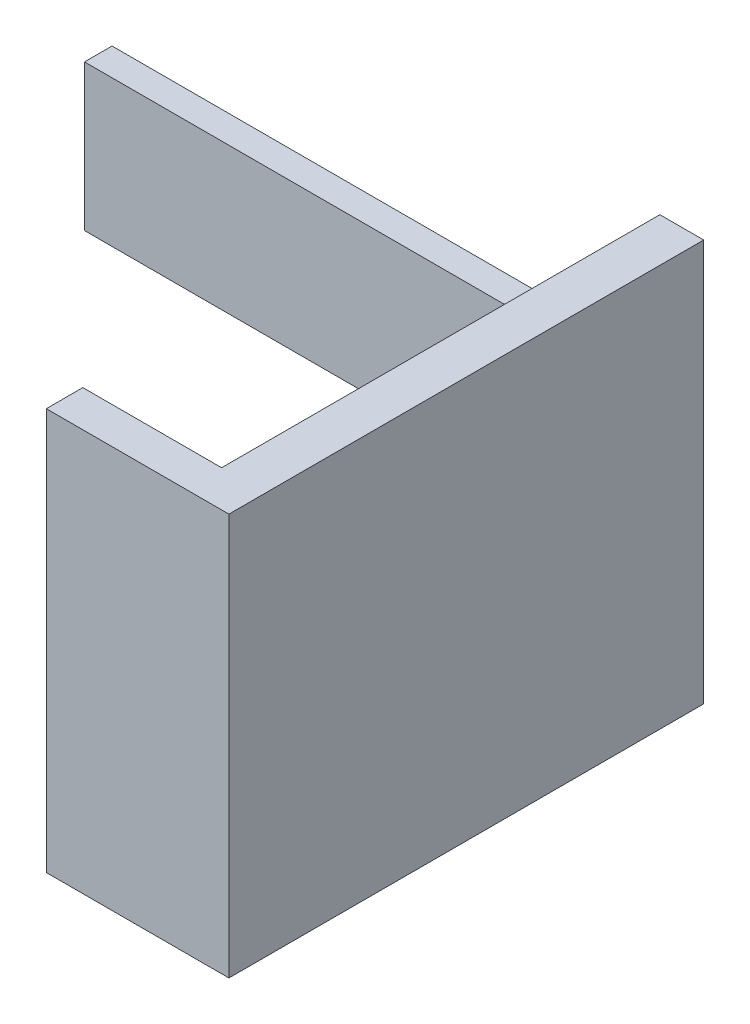
ISO-10303-21;
HEADER;
FILE_DESCRIPTION(('STEP AP214'),'2;1');
FILE_NAME('part.step','',(''),(''),'','','');
FILE_SCHEMA(('AUTOMOTIVE_DESIGN { 1 0 10303 214 1 1 1 1 }'));
ENDSEC;
DATA;
#1=APPLICATION_CONTEXT('core data for automotive mechanical design processes');
#2=APPLICATION_PROTOCOL_DEFINITION('international standard','automotive_design',2000,#1);
#3=PRODUCT_CONTEXT('',#1,'mechanical');
#4=PRODUCT('Part','Part','',(#3));
#5=PRODUCT_RELATED_PRODUCT_CATEGORY('part','',(#4));
#6=PRODUCT_DEFINITION_FORMATION('','',#4);
#7=PRODUCT_DEFINITION_CONTEXT('part definition',#1,'design');
#8=PRODUCT_DEFINITION('design','',#6,#7);
#9=PRODUCT_DEFINITION_SHAPE('','',#8);
#10=(LENGTH_UNIT() NAMED_UNIT(*) SI_UNIT(.MILLI.,.METRE.));
#11=(NAMED_UNIT(*) PLANE_ANGLE_UNIT() SI_UNIT($,.RADIAN.));
#12=(NAMED_UNIT(*) SI_UNIT($,.STERADIAN.) SOLID_ANGLE_UNIT());
#13=UNCERTAINTY_MEASURE_WITH_UNIT(LENGTH_MEASURE(1.E-05),#10,'distance_accuracy_value','');
#14=(GEOMETRIC_REPRESENTATION_CONTEXT(3) GLOBAL_UNCERTAINTY_ASSIGNED_CONTEXT((#13)) GLOBAL_UNIT_ASSIGNED_CONTEXT((#10,
#11,#12)) REPRESENTATION_CONTEXT('',''));
#15=CARTESIAN_POINT('',(0.,0.,0.));
#16=DIRECTION('',(0.,0.,1.));
#17=DIRECTION('',(1.,0.,0.));
#18=AXIS2_PLACEMENT_3D('',#15,#16,#17);
#19=CARTESIAN_POINT('',(-12.,110.,-120.));
#20=DIRECTION('',(1.,0.,0.));
#21=DIRECTION('',(0.,1.,0.));
#22=AXIS2_PLACEMENT_3D('',#19,#20,#21);
#23=PLANE('',#22);
#24=DIRECTION('',(0.,0.,1.));
#25=VECTOR('',#24,1.);
#26=CARTESIAN_POINT('',(-12.,35.,-120.));
#27=LINE('',#26,#25);
#28=CARTESIAN_POINT('',(-12.,35.,-120.));
#29=VERTEX_POINT('',#28);
#30=CARTESIAN_POINT('',(-12.,35.,-112.460533994195));
#31=VERTEX_POINT('',#30);
#32=EDGE_CURVE('E196',#29,#31,#27,.T.);
#33=ORIENTED_EDGE('',*,*,#32,.F.);
#34=DIRECTION('',(0.,1.,0.));
#35=VECTOR('',#34,1.);
#36=CARTESIAN_POINT('',(-12.,110.,-120.));
#37=LINE('',#36,#35);
#38=CARTESIAN_POINT('',(-12.,0.,-120.));
#39=VERTEX_POINT('',#38);
#40=EDGE_CURVE('E138',#39,#29,#37,.T.);
#41=ORIENTED_EDGE('',*,*,#40,.F.);
#42=DIRECTION('',(0.,0.,1.));
#43=VECTOR('',#42,1.);
#44=CARTESIAN_POINT('',(-12.,0.,-120.));
#45=LINE('',#44,#43);
#46=CARTESIAN_POINT('',(-12.,0.,0.));
#47=VERTEX_POINT('',#46);
#48=EDGE_CURVE('E157',#39,#47,#45,.T.);
#49=ORIENTED_EDGE('',*,*,#48,.T.);
#50=DIRECTION('',(0.,1.,0.));
#51=VECTOR('',#50,1.);
#52=CARTESIAN_POINT('',(-12.,110.,0.));
#53=LINE('',#52,#51);
#54=CARTESIAN_POINT('',(-12.,110.,0.));
#55=VERTEX_POINT('',#54);
#56=EDGE_CURVE('E62',#47,#55,#53,.T.);
#57=ORIENTED_EDGE('',*,*,#56,.T.);
#58=DIRECTION('',(0.,0.,1.));
#59=VECTOR('',#58,1.);
#60=CARTESIAN_POINT('',(-12.,110.,-120.));
#61=LINE('',#60,#59);
#62=CARTESIAN_POINT('',(-12.,110.,-120.));
#63=VERTEX_POINT('',#62);
#64=EDGE_CURVE('E153',#63,#55,#61,.T.);
#65=ORIENTED_EDGE('',*,*,#64,.F.);
#66=CARTESIAN_POINT('',(-12.,75.,-120.));
#67=VERTEX_POINT('',#66);
#68=EDGE_CURVE('E149',#67,#63,#37,.T.);
#69=ORIENTED_EDGE('',*,*,#68,.F.);
#70=DIRECTION('',(0.,0.,-1.));
#71=VECTOR('',#70,1.);
#72=CARTESIAN_POINT('',(-12.,75.,-120.));
#73=LINE('',#72,#71);
#74=CARTESIAN_POINT('',(-12.,75.,-112.460533994195));
#75=VERTEX_POINT('',#74);
#76=EDGE_CURVE('E132',#75,#67,#73,.T.);
#77=ORIENTED_EDGE('',*,*,#76,.F.);
#78=DIRECTION('',(0.,1.,0.));
#79=VECTOR('',#78,1.);
#80=CARTESIAN_POINT('',(-12.,75.,-112.460533994195));
#81=LINE('',#80,#79);
#82=EDGE_CURVE('E198',#31,#75,#81,.T.);
#83=ORIENTED_EDGE('',*,*,#82,.F.);
#84=EDGE_LOOP('',(#33,#41,#49,#57,#65,#69,#77,#83));
#85=FACE_BOUND('',#84,.T.);
#86=ADVANCED_FACE('F39',(#85),#23,.F.);
#87=CARTESIAN_POINT('',(0.,0.,0.));
#88=DIRECTION('',(0.,0.,1.));
#89=DIRECTION('',(1.,0.,0.));
#90=AXIS2_PLACEMENT_3D('',#87,#88,#89);
#91=PLANE('',#90);
#92=ORIENTED_EDGE('',*,*,#56,.F.);
#93=DIRECTION('',(1.,0.,0.));
#94=VECTOR('',#93,1.);
#95=CARTESIAN_POINT('',(0.,0.,0.));
#96=LINE('',#95,#94);
#97=CARTESIAN_POINT('',(-50.,0.,0.));
#98=VERTEX_POINT('',#97);
#99=EDGE_CURVE('E165',#98,#47,#96,.T.);
#100=ORIENTED_EDGE('',*,*,#99,.F.);
#101=DIRECTION('',(0.,-1.,0.));
#102=VECTOR('',#101,1.);
#103=CARTESIAN_POINT('',(-50.,0.,0.));
#104=LINE('',#103,#102);
#105=CARTESIAN_POINT('',(-50.,110.,0.));
#106=VERTEX_POINT('',#105);
#107=EDGE_CURVE('E173',#106,#98,#104,.T.);
#108=ORIENTED_EDGE('',*,*,#107,.F.);
#109=DIRECTION('',(-1.,0.,0.));
#110=VECTOR('',#109,1.);
#111=CARTESIAN_POINT('',(0.,110.,0.));
#112=LINE('',#111,#110);
#113=EDGE_CURVE('E160',#55,#106,#112,.T.);
#114=ORIENTED_EDGE('',*,*,#113,.F.);
#115=EDGE_LOOP('',(#92,#100,#108,#114));
#116=FACE_BOUND('',#115,.T.);
#117=ADVANCED_FACE('F187',(#116),#91,.F.);
#118=CARTESIAN_POINT('',(0.,0.,10.));
#119=DIRECTION('',(-1.,0.,0.));
#120=DIRECTION('',(0.,-1.,0.));
#121=AXIS2_PLACEMENT_3D('',#118,#119,#120);
#122=PLANE('',#121);
#123=DIRECTION('',(0.,0.,-1.));
#124=VECTOR('',#123,1.);
#125=CARTESIAN_POINT('',(0.,0.,10.));
#126=LINE('',#125,#124);
#127=CARTESIAN_POINT('',(0.,0.,10.));
#128=VERTEX_POINT('',#127);
#129=CARTESIAN_POINT('',(0.,0.,-120.));
#130=VERTEX_POINT('',#129);
#131=EDGE_CURVE('E171',#128,#130,#126,.T.);
#132=ORIENTED_EDGE('',*,*,#131,.T.);
#133=DIRECTION('',(0.,-1.,0.));
#134=VECTOR('',#133,1.);
#135=CARTESIAN_POINT('',(0.,110.,-120.));
#136=LINE('',#135,#134);
#137=CARTESIAN_POINT('',(0.,110.,-120.));
#138=VERTEX_POINT('',#137);
#139=EDGE_CURVE('E140',#138,#130,#136,.T.);
#140=ORIENTED_EDGE('',*,*,#139,.F.);
#141=DIRECTION('',(0.,0.,-1.));
#142=VECTOR('',#141,1.);
#143=CARTESIAN_POINT('',(0.,110.,10.));
#144=LINE('',#143,#142);
#145=CARTESIAN_POINT('',(0.,110.,10.));
#146=VERTEX_POINT('',#145);
#147=EDGE_CURVE('E11',#146,#138,#144,.T.);
#148=ORIENTED_EDGE('',*,*,#147,.F.);
#149=DIRECTION('',(0.,1.,0.));
#150=VECTOR('',#149,1.);
#151=CARTESIAN_POINT('',(0.,0.,10.));
#152=LINE('',#151,#150);
#153=EDGE_CURVE('E161',#128,#146,#152,.T.);
#154=ORIENTED_EDGE('',*,*,#153,.F.);
#155=EDGE_LOOP('',(#132,#140,#148,#154));
#156=FACE_BOUND('',#155,.T.);
#157=ADVANCED_FACE('F41',(#156),#122,.F.);
#158=CARTESIAN_POINT('',(0.,110.,10.));
#159=DIRECTION('',(0.,-1.,0.));
#160=DIRECTION('',(0.,0.,-1.));
#161=AXIS2_PLACEMENT_3D('',#158,#159,#160);
#162=PLANE('',#161);
#163=ORIENTED_EDGE('',*,*,#147,.T.);
#164=DIRECTION('',(1.,0.,0.));
#165=VECTOR('',#164,1.);
#166=CARTESIAN_POINT('',(0.,110.,-120.));
#167=LINE('',#166,#165);
#168=EDGE_CURVE('E151',#63,#138,#167,.T.);
#169=ORIENTED_EDGE('',*,*,#168,.F.);
#170=ORIENTED_EDGE('',*,*,#64,.T.);
#171=ORIENTED_EDGE('',*,*,#113,.T.);
#172=DIRECTION('',(0.,0.,-1.));
#173=VECTOR('',#172,1.);
#174=CARTESIAN_POINT('',(-50.,110.,10.));
#175=LINE('',#174,#173);
#176=CARTESIAN_POINT('',(-50.,110.,10.));
#177=VERTEX_POINT('',#176);
#178=EDGE_CURVE('E47',#177,#106,#175,.T.);
#179=ORIENTED_EDGE('',*,*,#178,.F.);
#180=DIRECTION('',(-1.,0.,0.));
#181=VECTOR('',#180,1.);
#182=CARTESIAN_POINT('',(0.,110.,10.));
#183=LINE('',#182,#181);
#184=EDGE_CURVE('E164',#146,#177,#183,.T.);
#185=ORIENTED_EDGE('',*,*,#184,.F.);
#186=EDGE_LOOP('',(#163,#169,#170,#171,#179,#185));
#187=FACE_BOUND('',#186,.T.);
#188=ADVANCED_FACE('F219',(#187),#162,.F.);
#189=CARTESIAN_POINT('',(-50.,0.,10.));
#190=DIRECTION('',(1.,0.,0.));
#191=DIRECTION('',(0.,0.,-1.));
#192=AXIS2_PLACEMENT_3D('',#189,#190,#191);
#193=PLANE('',#192);
#194=ORIENTED_EDGE('',*,*,#107,.T.);
#195=DIRECTION('',(0.,0.,-1.));
#196=VECTOR('',#195,1.);
#197=CARTESIAN_POINT('',(-50.,0.,10.));
#198=LINE('',#197,#196);
#199=CARTESIAN_POINT('',(-50.,0.,10.));
#200=VERTEX_POINT('',#199);
#201=EDGE_CURVE('E177',#200,#98,#198,.T.);
#202=ORIENTED_EDGE('',*,*,#201,.F.);
#203=DIRECTION('',(0.,-1.,0.));
#204=VECTOR('',#203,1.);
#205=CARTESIAN_POINT('',(-50.,0.,10.));
#206=LINE('',#205,#204);
#207=EDGE_CURVE('E167',#177,#200,#206,.T.);
#208=ORIENTED_EDGE('',*,*,#207,.F.);
#209=ORIENTED_EDGE('',*,*,#178,.T.);
#210=EDGE_LOOP('',(#194,#202,#208,#209));
#211=FACE_BOUND('',#210,.T.);
#212=ADVANCED_FACE('F184',(#211),#193,.F.);
#213=CARTESIAN_POINT('',(0.,0.,10.));
#214=DIRECTION('',(0.,1.,0.));
#215=DIRECTION('',(-1.,0.,0.));
#216=AXIS2_PLACEMENT_3D('',#213,#214,#215);
#217=PLANE('',#216);
#218=ORIENTED_EDGE('',*,*,#99,.T.);
#219=ORIENTED_EDGE('',*,*,#48,.F.);
#220=DIRECTION('',(-1.,0.,0.));
#221=VECTOR('',#220,1.);
#222=CARTESIAN_POINT('',(0.,0.,-120.));
#223=LINE('',#222,#221);
#224=EDGE_CURVE('E147',#130,#39,#223,.T.);
#225=ORIENTED_EDGE('',*,*,#224,.F.);
#226=ORIENTED_EDGE('',*,*,#131,.F.);
#227=DIRECTION('',(1.,0.,0.));
#228=VECTOR('',#227,1.);
#229=CARTESIAN_POINT('',(0.,0.,10.));
#230=LINE('',#229,#228);
#231=EDGE_CURVE('E169',#200,#128,#230,.T.);
#232=ORIENTED_EDGE('',*,*,#231,.F.);
#233=ORIENTED_EDGE('',*,*,#201,.T.);
#234=EDGE_LOOP('',(#218,#219,#225,#226,#232,#233));
#235=FACE_BOUND('',#234,.T.);
#236=ADVANCED_FACE('F190',(#235),#217,.F.);
#237=CARTESIAN_POINT('',(0.,0.,10.));
#238=DIRECTION('',(0.,0.,1.));
#239=DIRECTION('',(1.,0.,0.));
#240=AXIS2_PLACEMENT_3D('',#237,#238,#239);
#241=PLANE('',#240);
#242=ORIENTED_EDGE('',*,*,#153,.T.);
#243=ORIENTED_EDGE('',*,*,#184,.T.);
#244=ORIENTED_EDGE('',*,*,#207,.T.);
#245=ORIENTED_EDGE('',*,*,#231,.T.);
#246=EDGE_LOOP('',(#242,#243,#244,#245));
#247=FACE_BOUND('',#246,.T.);
#248=ADVANCED_FACE('F218',(#247),#241,.T.);
#249=CARTESIAN_POINT('',(0.,0.,-120.));
#250=DIRECTION('',(0.,0.,-1.));
#251=DIRECTION('',(-1.,0.,0.));
#252=AXIS2_PLACEMENT_3D('',#249,#250,#251);
#253=PLANE('',#252);
#254=ORIENTED_EDGE('',*,*,#139,.T.);
#255=ORIENTED_EDGE('',*,*,#224,.T.);
#256=ORIENTED_EDGE('',*,*,#40,.T.);
#257=DIRECTION('',(1.,0.,0.));
#258=VECTOR('',#257,1.);
#259=CARTESIAN_POINT('',(-162.,35.,-120.));
#260=LINE('',#259,#258);
#261=CARTESIAN_POINT('',(-162.,35.,-120.));
#262=VERTEX_POINT('',#261);
#263=EDGE_CURVE('E120',#262,#29,#260,.T.);
#264=ORIENTED_EDGE('',*,*,#263,.F.);
#265=DIRECTION('',(0.,-1.,0.));
#266=VECTOR('',#265,1.);
#267=CARTESIAN_POINT('',(-162.,75.,-120.));
#268=LINE('',#267,#266);
#269=CARTESIAN_POINT('',(-162.,75.,-120.));
#270=VERTEX_POINT('',#269);
#271=EDGE_CURVE('E127',#270,#262,#268,.T.);
#272=ORIENTED_EDGE('',*,*,#271,.F.);
#273=DIRECTION('',(1.,0.,0.));
#274=VECTOR('',#273,1.);
#275=CARTESIAN_POINT('',(-162.,75.,-120.));
#276=LINE('',#275,#274);
#277=EDGE_CURVE('E54',#270,#67,#276,.T.);
#278=ORIENTED_EDGE('',*,*,#277,.T.);
#279=ORIENTED_EDGE('',*,*,#68,.T.);
#280=ORIENTED_EDGE('',*,*,#168,.T.);
#281=EDGE_LOOP('',(#254,#255,#256,#264,#272,#278,#279,#280));
#282=FACE_BOUND('',#281,.T.);
#283=ADVANCED_FACE('F136',(#282),#253,.T.);
#284=CARTESIAN_POINT('',(-162.,35.,-120.));
#285=DIRECTION('',(0.,1.,0.));
#286=DIRECTION('',(-1.,0.,0.));
#287=AXIS2_PLACEMENT_3D('',#284,#285,#286);
#288=PLANE('',#287);
#289=ORIENTED_EDGE('',*,*,#32,.T.);
#290=DIRECTION('',(1.,0.,0.));
#291=VECTOR('',#290,1.);
#292=CARTESIAN_POINT('',(-162.,35.,-112.460533994195));
#293=LINE('',#292,#291);
#294=CARTESIAN_POINT('',(-162.,35.,-112.460533994195));
#295=VERTEX_POINT('',#294);
#296=EDGE_CURVE('E123',#295,#31,#293,.T.);
#297=ORIENTED_EDGE('',*,*,#296,.F.);
#298=DIRECTION('',(0.,0.,1.));
#299=VECTOR('',#298,1.);
#300=CARTESIAN_POINT('',(-162.,35.,-120.));
#301=LINE('',#300,#299);
#302=EDGE_CURVE('E116',#262,#295,#301,.T.);
#303=ORIENTED_EDGE('',*,*,#302,.F.);
#304=ORIENTED_EDGE('',*,*,#263,.T.);
#305=EDGE_LOOP('',(#289,#297,#303,#304));
#306=FACE_BOUND('',#305,.T.);
#307=ADVANCED_FACE('F118',(#306),#288,.F.);
#308=CARTESIAN_POINT('',(-162.,75.,-112.460533994195));
#309=DIRECTION('',(0.,0.,-1.));
#310=DIRECTION('',(-1.,0.,0.));
#311=AXIS2_PLACEMENT_3D('',#308,#309,#310);
#312=PLANE('',#311);
#313=ORIENTED_EDGE('',*,*,#82,.T.);
#314=DIRECTION('',(1.,0.,0.));
#315=VECTOR('',#314,1.);
#316=CARTESIAN_POINT('',(-162.,75.,-112.460533994195));
#317=LINE('',#316,#315);
#318=CARTESIAN_POINT('',(-162.,75.,-112.460533994195));
#319=VERTEX_POINT('',#318);
#320=EDGE_CURVE('E142',#319,#75,#317,.T.);
#321=ORIENTED_EDGE('',*,*,#320,.F.);
#322=DIRECTION('',(0.,1.,0.));
#323=VECTOR('',#322,1.);
#324=CARTESIAN_POINT('',(-162.,75.,-112.460533994195));
#325=LINE('',#324,#323);
#326=EDGE_CURVE('E126',#295,#319,#325,.T.);
#327=ORIENTED_EDGE('',*,*,#326,.F.);
#328=ORIENTED_EDGE('',*,*,#296,.T.);
#329=EDGE_LOOP('',(#313,#321,#327,#328));
#330=FACE_BOUND('',#329,.T.);
#331=ADVANCED_FACE('F258',(#330),#312,.F.);
#332=CARTESIAN_POINT('',(-162.,75.,-120.));
#333=DIRECTION('',(0.,-1.,0.));
#334=DIRECTION('',(1.,0.,0.));
#335=AXIS2_PLACEMENT_3D('',#332,#333,#334);
#336=PLANE('',#335);
#337=ORIENTED_EDGE('',*,*,#76,.T.);
#338=ORIENTED_EDGE('',*,*,#277,.F.);
#339=DIRECTION('',(0.,0.,-1.));
#340=VECTOR('',#339,1.);
#341=CARTESIAN_POINT('',(-162.,75.,-120.));
#342=LINE('',#341,#340);
#343=EDGE_CURVE('E131',#319,#270,#342,.T.);
#344=ORIENTED_EDGE('',*,*,#343,.F.);
#345=ORIENTED_EDGE('',*,*,#320,.T.);
#346=EDGE_LOOP('',(#337,#338,#344,#345));
#347=FACE_BOUND('',#346,.T.);
#348=ADVANCED_FACE('F208',(#347),#336,.F.);
#349=CARTESIAN_POINT('',(-162.,0.,0.));
#350=DIRECTION('',(-1.,0.,0.));
#351=DIRECTION('',(0.,-1.,0.));
#352=AXIS2_PLACEMENT_3D('',#349,#350,#351);
#353=PLANE('',#352);
#354=ORIENTED_EDGE('',*,*,#271,.T.);
#355=ORIENTED_EDGE('',*,*,#302,.T.);
#356=ORIENTED_EDGE('',*,*,#326,.T.);
#357=ORIENTED_EDGE('',*,*,#343,.T.);
#358=EDGE_LOOP('',(#354,#355,#356,#357));
#359=FACE_BOUND('',#358,.T.);
#360=ADVANCED_FACE('F129',(#359),#353,.T.);
#361=CLOSED_SHELL('',(#86,#117,#157,#188,#212,#236,#248,#283,#307,#331,#348,#360));
#362=MANIFOLD_SOLID_BREP('B2',#361);
#363=ADVANCED_BREP_SHAPE_REPRESENTATION('',(#18,#362),#14);
#364=SHAPE_DEFINITION_REPRESENTATION(#9,#363);
ENDSEC;
END-ISO-10303-21;
